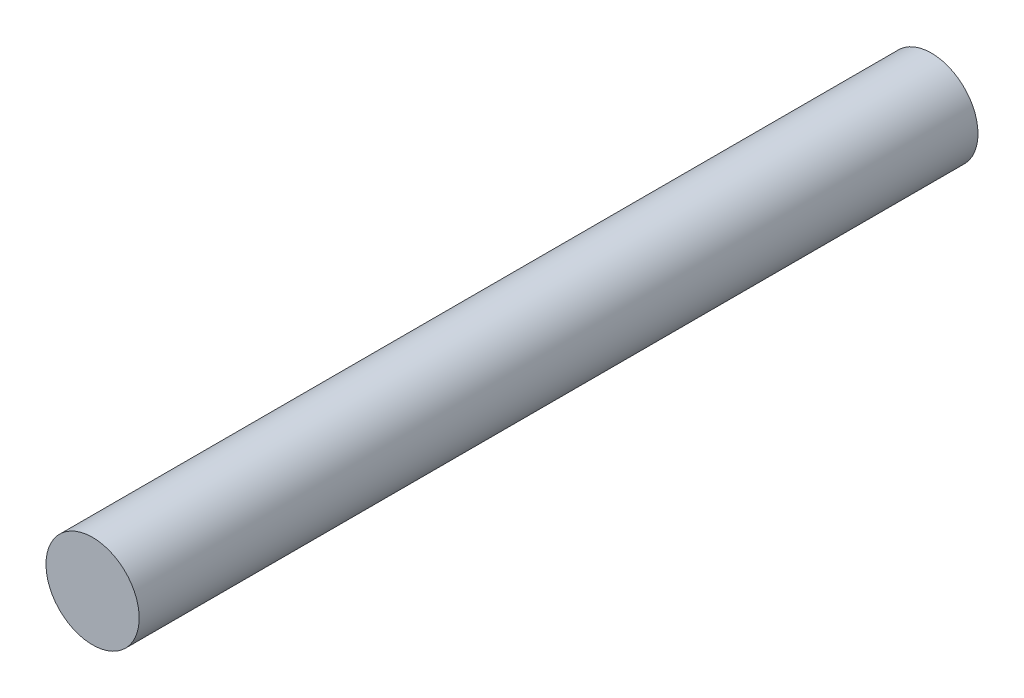
ISO-10303-21;
HEADER;
FILE_DESCRIPTION(('STEP AP214'),'2;1');
FILE_NAME('part.step','',(''),(''),'','','');
FILE_SCHEMA(('AUTOMOTIVE_DESIGN { 1 0 10303 214 1 1 1 1 }'));
ENDSEC;
DATA;
#1=APPLICATION_CONTEXT('core data for automotive mechanical design processes');
#2=APPLICATION_PROTOCOL_DEFINITION('international standard','automotive_design',2000,#1);
#3=PRODUCT_CONTEXT('',#1,'mechanical');
#4=PRODUCT('Part','Part','',(#3));
#5=PRODUCT_RELATED_PRODUCT_CATEGORY('part','',(#4));
#6=PRODUCT_DEFINITION_FORMATION('','',#4);
#7=PRODUCT_DEFINITION_CONTEXT('part definition',#1,'design');
#8=PRODUCT_DEFINITION('design','',#6,#7);
#9=PRODUCT_DEFINITION_SHAPE('','',#8);
#10=(LENGTH_UNIT() NAMED_UNIT(*) SI_UNIT(.MILLI.,.METRE.));
#11=(NAMED_UNIT(*) PLANE_ANGLE_UNIT() SI_UNIT($,.RADIAN.));
#12=(NAMED_UNIT(*) SI_UNIT($,.STERADIAN.) SOLID_ANGLE_UNIT());
#13=UNCERTAINTY_MEASURE_WITH_UNIT(LENGTH_MEASURE(1.E-05),#10,'distance_accuracy_value','');
#14=(GEOMETRIC_REPRESENTATION_CONTEXT(3) GLOBAL_UNCERTAINTY_ASSIGNED_CONTEXT((#13)) GLOBAL_UNIT_ASSIGNED_CONTEXT((#10,
#11,#12)) REPRESENTATION_CONTEXT('',''));
#15=CARTESIAN_POINT('',(0.,0.,0.));
#16=DIRECTION('',(0.,0.,1.));
#17=DIRECTION('',(1.,0.,0.));
#18=AXIS2_PLACEMENT_3D('',#15,#16,#17);
#19=CARTESIAN_POINT('',(0.,0.,0.));
#20=DIRECTION('',(0.,0.,1.));
#21=DIRECTION('',(1.,0.,0.));
#22=AXIS2_PLACEMENT_3D('',#19,#20,#21);
#23=PLANE('',#22);
#24=CARTESIAN_POINT('',(0.,0.,0.));
#25=DIRECTION('',(0.,0.,1.));
#26=DIRECTION('',(1.,0.,0.));
#27=AXIS2_PLACEMENT_3D('',#24,#25,#26);
#28=CIRCLE('',#27,5.);
#29=CARTESIAN_POINT('',(5.,0.,0.));
#30=VERTEX_POINT('',#29);
#31=EDGE_CURVE('E39',#30,#30,#28,.T.);
#32=ORIENTED_EDGE('',*,*,#31,.F.);
#33=EDGE_LOOP('',(#32));
#34=FACE_BOUND('',#33,.T.);
#35=ADVANCED_FACE('F35',(#34),#23,.F.);
#36=CARTESIAN_POINT('',(0.,0.,104.142135623731));
#37=DIRECTION('',(0.,0.,-1.));
#38=DIRECTION('',(-1.,0.,0.));
#39=AXIS2_PLACEMENT_3D('',#36,#37,#38);
#40=CYLINDRICAL_SURFACE('',#39,5.);
#41=CARTESIAN_POINT('',(0.,0.,90.0000000000001));
#42=DIRECTION('',(0.,0.,-1.));
#43=DIRECTION('',(0.,1.,0.));
#44=AXIS2_PLACEMENT_3D('',#41,#42,#43);
#45=CIRCLE('',#44,5.);
#46=CARTESIAN_POINT('',(0.,5.00000000000001,90.0000000000001));
#47=VERTEX_POINT('',#46);
#48=EDGE_CURVE('E10',#47,#47,#45,.T.);
#49=ORIENTED_EDGE('',*,*,#48,.T.);
#50=EDGE_LOOP('',(#49));
#51=FACE_BOUND('',#50,.T.);
#52=ORIENTED_EDGE('',*,*,#31,.T.);
#53=EDGE_LOOP('',(#52));
#54=FACE_BOUND('',#53,.T.);
#55=ADVANCED_FACE('F37',(#51,#54),#40,.T.);
#56=CARTESIAN_POINT('',(0.,0.,90.0000000000001));
#57=DIRECTION('',(0.,0.,-1.));
#58=DIRECTION('',(0.,1.,0.));
#59=AXIS2_PLACEMENT_3D('',#56,#57,#58);
#60=PLANE('',#59);
#61=ORIENTED_EDGE('',*,*,#48,.F.);
#62=EDGE_LOOP('',(#61));
#63=FACE_BOUND('',#62,.T.);
#64=ADVANCED_FACE('F53',(#63),#60,.F.);
#65=CLOSED_SHELL('',(#35,#55,#64));
#66=MANIFOLD_SOLID_BREP('B2',#65);
#67=ADVANCED_BREP_SHAPE_REPRESENTATION('',(#18,#66),#14);
#68=SHAPE_DEFINITION_REPRESENTATION(#9,#67);
ENDSEC;
END-ISO-10303-21;
